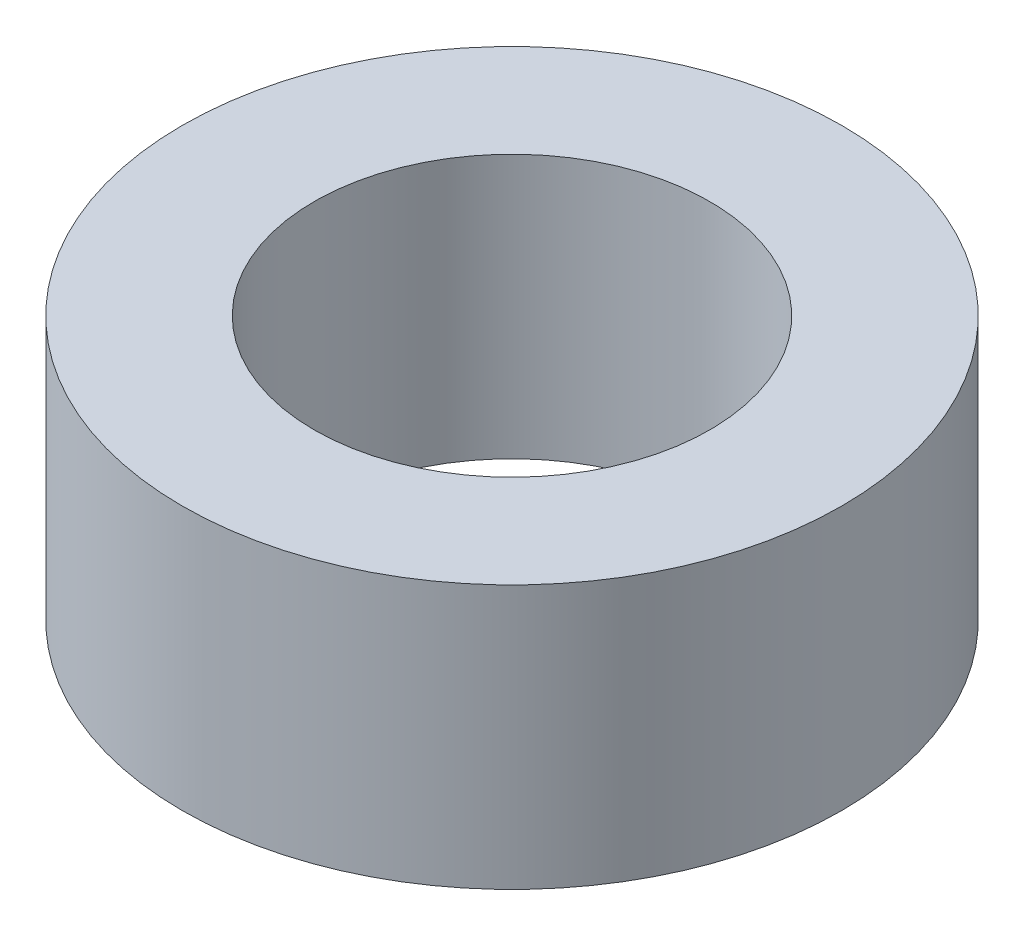
ISO-10303-21;
HEADER;
FILE_DESCRIPTION(('STEP AP214'),'2;1');
FILE_NAME('part.step','',(''),(''),'','','');
FILE_SCHEMA(('AUTOMOTIVE_DESIGN { 1 0 10303 214 1 1 1 1 }'));
ENDSEC;
DATA;
#1=APPLICATION_CONTEXT('core data for automotive mechanical design processes');
#2=APPLICATION_PROTOCOL_DEFINITION('international standard','automotive_design',2000,#1);
#3=PRODUCT_CONTEXT('',#1,'mechanical');
#4=PRODUCT('Part','Part','',(#3));
#5=PRODUCT_RELATED_PRODUCT_CATEGORY('part','',(#4));
#6=PRODUCT_DEFINITION_FORMATION('','',#4);
#7=PRODUCT_DEFINITION_CONTEXT('part definition',#1,'design');
#8=PRODUCT_DEFINITION('design','',#6,#7);
#9=PRODUCT_DEFINITION_SHAPE('','',#8);
#10=(LENGTH_UNIT() NAMED_UNIT(*) SI_UNIT(.MILLI.,.METRE.));
#11=(NAMED_UNIT(*) PLANE_ANGLE_UNIT() SI_UNIT($,.RADIAN.));
#12=(NAMED_UNIT(*) SI_UNIT($,.STERADIAN.) SOLID_ANGLE_UNIT());
#13=UNCERTAINTY_MEASURE_WITH_UNIT(LENGTH_MEASURE(1.E-05),#10,'distance_accuracy_value','');
#14=(GEOMETRIC_REPRESENTATION_CONTEXT(3) GLOBAL_UNCERTAINTY_ASSIGNED_CONTEXT((#13)) GLOBAL_UNIT_ASSIGNED_CONTEXT((#10,
#11,#12)) REPRESENTATION_CONTEXT('',''));
#15=CARTESIAN_POINT('',(0.,0.,0.));
#16=DIRECTION('',(0.,0.,1.));
#17=DIRECTION('',(1.,0.,0.));
#18=AXIS2_PLACEMENT_3D('',#15,#16,#17);
#19=CARTESIAN_POINT('',(0.,8.,0.));
#20=DIRECTION('',(0.,-1.,0.));
#21=DIRECTION('',(0.,0.,-1.));
#22=AXIS2_PLACEMENT_3D('',#19,#20,#21);
#23=CYLINDRICAL_SURFACE('',#22,10.);
#24=CARTESIAN_POINT('',(0.,8.,0.));
#25=DIRECTION('',(0.,1.,0.));
#26=DIRECTION('',(0.,0.,1.));
#27=AXIS2_PLACEMENT_3D('',#24,#25,#26);
#28=CIRCLE('',#27,10.);
#29=CARTESIAN_POINT('',(0.,8.,10.));
#30=VERTEX_POINT('',#29);
#31=EDGE_CURVE('E10',#30,#30,#28,.T.);
#32=ORIENTED_EDGE('',*,*,#31,.F.);
#33=EDGE_LOOP('',(#32));
#34=FACE_BOUND('',#33,.T.);
#35=CARTESIAN_POINT('',(0.,0.,0.));
#36=DIRECTION('',(0.,1.,0.));
#37=DIRECTION('',(0.,0.,1.));
#38=AXIS2_PLACEMENT_3D('',#35,#36,#37);
#39=CIRCLE('',#38,10.);
#40=CARTESIAN_POINT('',(0.,0.,10.));
#41=VERTEX_POINT('',#40);
#42=EDGE_CURVE('E40',#41,#41,#39,.T.);
#43=ORIENTED_EDGE('',*,*,#42,.T.);
#44=EDGE_LOOP('',(#43));
#45=FACE_BOUND('',#44,.T.);
#46=ADVANCED_FACE('F37',(#34,#45),#23,.T.);
#47=CARTESIAN_POINT('',(0.,8.,0.));
#48=DIRECTION('',(0.,1.,0.));
#49=DIRECTION('',(0.,0.,1.));
#50=AXIS2_PLACEMENT_3D('',#47,#48,#49);
#51=PLANE('',#50);
#52=CARTESIAN_POINT('',(0.,8.,0.));
#53=DIRECTION('',(0.,1.,0.));
#54=DIRECTION('',(0.,0.,1.));
#55=AXIS2_PLACEMENT_3D('',#52,#53,#54);
#56=CIRCLE('',#55,6.);
#57=CARTESIAN_POINT('',(0.,8.,6.));
#58=VERTEX_POINT('',#57);
#59=EDGE_CURVE('E49',#58,#58,#56,.T.);
#60=ORIENTED_EDGE('',*,*,#59,.F.);
#61=EDGE_LOOP('',(#60));
#62=FACE_BOUND('',#61,.T.);
#63=ORIENTED_EDGE('',*,*,#31,.T.);
#64=EDGE_LOOP('',(#63));
#65=FACE_BOUND('',#64,.T.);
#66=ADVANCED_FACE('F64',(#62,#65),#51,.T.);
#67=CARTESIAN_POINT('',(0.,0.,0.));
#68=DIRECTION('',(0.,1.,0.));
#69=DIRECTION('',(0.,0.,1.));
#70=AXIS2_PLACEMENT_3D('',#67,#68,#69);
#71=PLANE('',#70);
#72=CARTESIAN_POINT('',(0.,0.,0.));
#73=DIRECTION('',(0.,1.,0.));
#74=DIRECTION('',(0.,0.,1.));
#75=AXIS2_PLACEMENT_3D('',#72,#73,#74);
#76=CIRCLE('',#75,6.);
#77=CARTESIAN_POINT('',(0.,0.,6.));
#78=VERTEX_POINT('',#77);
#79=EDGE_CURVE('E47',#78,#78,#76,.T.);
#80=ORIENTED_EDGE('',*,*,#79,.T.);
#81=EDGE_LOOP('',(#80));
#82=FACE_BOUND('',#81,.T.);
#83=ORIENTED_EDGE('',*,*,#42,.F.);
#84=EDGE_LOOP('',(#83));
#85=FACE_BOUND('',#84,.T.);
#86=ADVANCED_FACE('F55',(#82,#85),#71,.F.);
#87=CARTESIAN_POINT('',(0.,0.,0.));
#88=DIRECTION('',(0.,1.,0.));
#89=DIRECTION('',(0.,0.,1.));
#90=AXIS2_PLACEMENT_3D('',#87,#88,#89);
#91=CYLINDRICAL_SURFACE('',#90,6.);
#92=ORIENTED_EDGE('',*,*,#79,.F.);
#93=EDGE_LOOP('',(#92));
#94=FACE_BOUND('',#93,.T.);
#95=ORIENTED_EDGE('',*,*,#59,.T.);
#96=EDGE_LOOP('',(#95));
#97=FACE_BOUND('',#96,.T.);
#98=ADVANCED_FACE('F58',(#94,#97),#91,.F.);
#99=CLOSED_SHELL('',(#46,#66,#86,#98));
#100=MANIFOLD_SOLID_BREP('B2',#99);
#101=ADVANCED_BREP_SHAPE_REPRESENTATION('',(#18,#100),#14);
#102=SHAPE_DEFINITION_REPRESENTATION(#9,#101);
ENDSEC;
END-ISO-10303-21;
